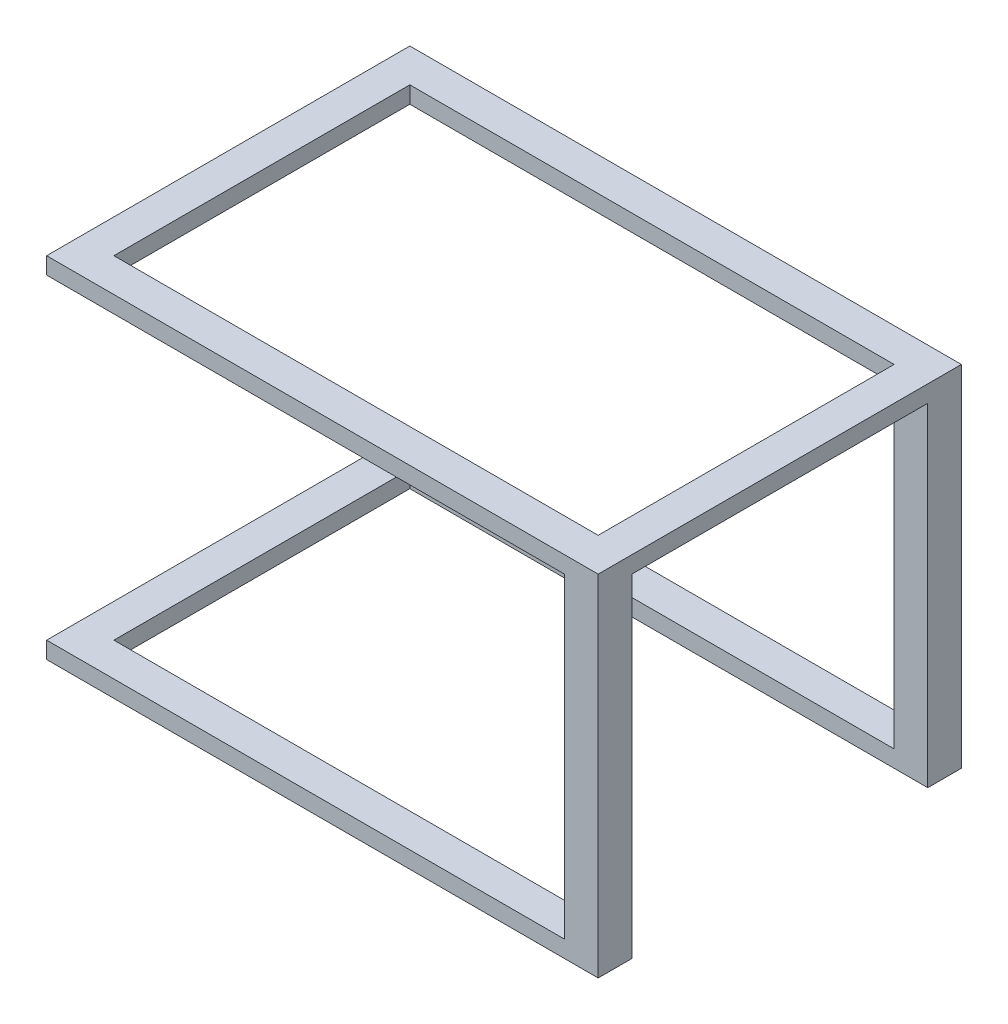
ISO-10303-21;
HEADER;
FILE_DESCRIPTION(('STEP AP214'),'2;1');
FILE_NAME('part.step','',(''),(''),'','','');
FILE_SCHEMA(('AUTOMOTIVE_DESIGN { 1 0 10303 214 1 1 1 1 }'));
ENDSEC;
DATA;
#1=APPLICATION_CONTEXT('core data for automotive mechanical design processes');
#2=APPLICATION_PROTOCOL_DEFINITION('international standard','automotive_design',2000,#1);
#3=PRODUCT_CONTEXT('',#1,'mechanical');
#4=PRODUCT('Part','Part','',(#3));
#5=PRODUCT_RELATED_PRODUCT_CATEGORY('part','',(#4));
#6=PRODUCT_DEFINITION_FORMATION('','',#4);
#7=PRODUCT_DEFINITION_CONTEXT('part definition',#1,'design');
#8=PRODUCT_DEFINITION('design','',#6,#7);
#9=PRODUCT_DEFINITION_SHAPE('','',#8);
#10=(LENGTH_UNIT() NAMED_UNIT(*) SI_UNIT(.MILLI.,.METRE.));
#11=(NAMED_UNIT(*) PLANE_ANGLE_UNIT() SI_UNIT($,.RADIAN.));
#12=(NAMED_UNIT(*) SI_UNIT($,.STERADIAN.) SOLID_ANGLE_UNIT());
#13=UNCERTAINTY_MEASURE_WITH_UNIT(LENGTH_MEASURE(1.E-05),#10,'distance_accuracy_value','');
#14=(GEOMETRIC_REPRESENTATION_CONTEXT(3) GLOBAL_UNCERTAINTY_ASSIGNED_CONTEXT((#13)) GLOBAL_UNIT_ASSIGNED_CONTEXT((#10,
#11,#12)) REPRESENTATION_CONTEXT('',''));
#15=CARTESIAN_POINT('',(0.,0.,0.));
#16=DIRECTION('',(0.,0.,1.));
#17=DIRECTION('',(1.,0.,0.));
#18=AXIS2_PLACEMENT_3D('',#15,#16,#17);
#19=CARTESIAN_POINT('',(587.28007311288,-49.5244188250893,415.065585719393));
#20=DIRECTION('',(1.,0.,0.));
#21=DIRECTION('',(0.,1.,0.));
#22=AXIS2_PLACEMENT_3D('',#19,#20,#21);
#23=PLANE('',#22);
#24=DIRECTION('',(0.,0.,-1.));
#25=VECTOR('',#24,1.);
#26=CARTESIAN_POINT('',(587.28007311288,-49.5244188250893,415.065585719393));
#27=LINE('',#26,#25);
#28=CARTESIAN_POINT('',(587.28007311288,-49.5244188250893,415.065585719393));
#29=VERTEX_POINT('',#28);
#30=CARTESIAN_POINT('',(587.28007311288,-49.5244188250893,365.065585719393));
#31=VERTEX_POINT('',#30);
#32=EDGE_CURVE('E47',#29,#31,#27,.T.);
#33=ORIENTED_EDGE('',*,*,#32,.T.);
#34=DIRECTION('',(0.,-1.,0.));
#35=VECTOR('',#34,1.);
#36=CARTESIAN_POINT('',(587.28007311288,-49.5244188250893,365.065585719393));
#37=LINE('',#36,#35);
#38=CARTESIAN_POINT('',(587.28007311288,-519.524418825089,365.065585719393));
#39=VERTEX_POINT('',#38);
#40=EDGE_CURVE('E202',#31,#39,#37,.T.);
#41=ORIENTED_EDGE('',*,*,#40,.T.);
#42=DIRECTION('',(0.,0.,-1.));
#43=VECTOR('',#42,1.);
#44=CARTESIAN_POINT('',(587.28007311288,-519.524418825089,415.065585719393));
#45=LINE('',#44,#43);
#46=CARTESIAN_POINT('',(587.28007311288,-519.524418825089,415.065585719393));
#47=VERTEX_POINT('',#46);
#48=EDGE_CURVE('E238',#47,#39,#45,.T.);
#49=ORIENTED_EDGE('',*,*,#48,.F.);
#50=DIRECTION('',(0.,-1.,0.));
#51=VECTOR('',#50,1.);
#52=CARTESIAN_POINT('',(587.28007311288,-49.5244188250893,415.065585719393));
#53=LINE('',#52,#51);
#54=EDGE_CURVE('E235',#29,#47,#53,.T.);
#55=ORIENTED_EDGE('',*,*,#54,.F.);
#56=EDGE_LOOP('',(#33,#41,#49,#55));
#57=FACE_BOUND('',#56,.T.);
#58=ADVANCED_FACE('F37',(#57),#23,.F.);
#59=DIRECTION('',(0.,1.,0.));
#60=VECTOR('',#59,1.);
#61=CARTESIAN_POINT('',(587.28007311288,-544.524418825089,-74.934414280607));
#62=LINE('',#61,#60);
#63=CARTESIAN_POINT('',(587.28007311288,-49.5244188250893,-74.934414280607));
#64=VERTEX_POINT('',#63);
#65=CARTESIAN_POINT('',(587.28007311288,-24.5244188250893,-74.934414280607));
#66=VERTEX_POINT('',#65);
#67=EDGE_CURVE('E226',#64,#66,#62,.T.);
#68=ORIENTED_EDGE('',*,*,#67,.F.);
#69=DIRECTION('',(0.,0.,1.));
#70=VECTOR('',#69,1.);
#71=CARTESIAN_POINT('',(587.28007311288,-49.5244188250893,415.065585719393));
#72=LINE('',#71,#70);
#73=EDGE_CURVE('E212',#64,#31,#72,.T.);
#74=ORIENTED_EDGE('',*,*,#73,.T.);
#75=DIRECTION('',(0.,1.,0.));
#76=VECTOR('',#75,1.);
#77=CARTESIAN_POINT('',(587.28007311288,-544.524418825089,365.065585719393));
#78=LINE('',#77,#76);
#79=CARTESIAN_POINT('',(587.28007311288,-24.5244188250893,365.065585719393));
#80=VERTEX_POINT('',#79);
#81=EDGE_CURVE('E223',#31,#80,#78,.T.);
#82=ORIENTED_EDGE('',*,*,#81,.T.);
#83=DIRECTION('',(0.,0.,-1.));
#84=VECTOR('',#83,1.);
#85=CARTESIAN_POINT('',(587.28007311288,-24.5244188250893,-74.934414280607));
#86=LINE('',#85,#84);
#87=EDGE_CURVE('E247',#80,#66,#86,.T.);
#88=ORIENTED_EDGE('',*,*,#87,.T.);
#89=EDGE_LOOP('',(#68,#74,#82,#88));
#90=FACE_BOUND('',#89,.T.);
#91=ADVANCED_FACE('F220',(#90),#23,.F.);
#92=CARTESIAN_POINT('',(-182.71992688712,-24.5244188250893,415.065585719393));
#93=DIRECTION('',(1.,0.,0.));
#94=DIRECTION('',(0.,0.,-1.));
#95=AXIS2_PLACEMENT_3D('',#92,#93,#94);
#96=PLANE('',#95);
#97=DIRECTION('',(0.,-1.,0.));
#98=VECTOR('',#97,1.);
#99=CARTESIAN_POINT('',(-182.71992688712,-24.5244188250893,-124.934414280607));
#100=LINE('',#99,#98);
#101=CARTESIAN_POINT('',(-182.71992688712,-24.5244188250893,-124.934414280607));
#102=VERTEX_POINT('',#101);
#103=CARTESIAN_POINT('',(-182.71992688712,-49.5244188250893,-124.934414280607));
#104=VERTEX_POINT('',#103);
#105=EDGE_CURVE('E252',#102,#104,#100,.T.);
#106=ORIENTED_EDGE('',*,*,#105,.T.);
#107=DIRECTION('',(0.,0.,-1.));
#108=VECTOR('',#107,1.);
#109=CARTESIAN_POINT('',(-182.71992688712,-49.5244188250893,415.065585719393));
#110=LINE('',#109,#108);
#111=CARTESIAN_POINT('',(-182.71992688712,-49.5244188250893,415.065585719393));
#112=VERTEX_POINT('',#111);
#113=EDGE_CURVE('E11',#112,#104,#110,.T.);
#114=ORIENTED_EDGE('',*,*,#113,.F.);
#115=DIRECTION('',(0.,-1.,0.));
#116=VECTOR('',#115,1.);
#117=CARTESIAN_POINT('',(-182.71992688712,-24.5244188250893,415.065585719393));
#118=LINE('',#117,#116);
#119=CARTESIAN_POINT('',(-182.71992688712,-24.5244188250893,415.065585719393));
#120=VERTEX_POINT('',#119);
#121=EDGE_CURVE('E254',#120,#112,#118,.T.);
#122=ORIENTED_EDGE('',*,*,#121,.F.);
#123=DIRECTION('',(0.,0.,-1.));
#124=VECTOR('',#123,1.);
#125=CARTESIAN_POINT('',(-182.71992688712,-24.5244188250893,415.065585719393));
#126=LINE('',#125,#124);
#127=EDGE_CURVE('E261',#120,#102,#126,.T.);
#128=ORIENTED_EDGE('',*,*,#127,.T.);
#129=EDGE_LOOP('',(#106,#114,#122,#128));
#130=FACE_BOUND('',#129,.T.);
#131=ADVANCED_FACE('F357',(#130),#96,.F.);
#132=CARTESIAN_POINT('',(-182.71992688712,-49.5244188250893,415.065585719393));
#133=DIRECTION('',(0.,1.,0.));
#134=DIRECTION('',(0.,0.,1.));
#135=AXIS2_PLACEMENT_3D('',#132,#133,#134);
#136=PLANE('',#135);
#137=DIRECTION('',(0.,0.,-1.));
#138=VECTOR('',#137,1.);
#139=CARTESIAN_POINT('',(587.28007311288,-49.5244188250893,415.065585719393));
#140=LINE('',#139,#138);
#141=CARTESIAN_POINT('',(587.28007311288,-49.5244188250893,-124.934414280607));
#142=VERTEX_POINT('',#141);
#143=EDGE_CURVE('E236',#64,#142,#140,.T.);
#144=ORIENTED_EDGE('',*,*,#143,.F.);
#145=DIRECTION('',(-1.,0.,0.));
#146=VECTOR('',#145,1.);
#147=CARTESIAN_POINT('',(-182.71992688712,-49.5244188250893,-74.9344142806071));
#148=LINE('',#147,#146);
#149=CARTESIAN_POINT('',(-132.71992688712,-49.5244188250893,-74.934414280607));
#150=VERTEX_POINT('',#149);
#151=EDGE_CURVE('E183',#64,#150,#148,.T.);
#152=ORIENTED_EDGE('',*,*,#151,.T.);
#153=DIRECTION('',(0.,0.,1.));
#154=VECTOR('',#153,1.);
#155=CARTESIAN_POINT('',(-132.71992688712,-49.5244188250893,415.065585719393));
#156=LINE('',#155,#154);
#157=CARTESIAN_POINT('',(-132.71992688712,-49.5244188250893,365.065585719393));
#158=VERTEX_POINT('',#157);
#159=EDGE_CURVE('E192',#150,#158,#156,.T.);
#160=ORIENTED_EDGE('',*,*,#159,.T.);
#161=DIRECTION('',(1.,0.,0.));
#162=VECTOR('',#161,1.);
#163=CARTESIAN_POINT('',(-182.71992688712,-49.5244188250893,365.065585719393));
#164=LINE('',#163,#162);
#165=EDGE_CURVE('E188',#158,#31,#164,.T.);
#166=ORIENTED_EDGE('',*,*,#165,.T.);
#167=ORIENTED_EDGE('',*,*,#32,.F.);
#168=DIRECTION('',(1.,0.,0.));
#169=VECTOR('',#168,1.);
#170=CARTESIAN_POINT('',(-182.71992688712,-49.5244188250893,415.065585719393));
#171=LINE('',#170,#169);
#172=EDGE_CURVE('E164',#112,#29,#171,.T.);
#173=ORIENTED_EDGE('',*,*,#172,.F.);
#174=ORIENTED_EDGE('',*,*,#113,.T.);
#175=DIRECTION('',(1.,0.,0.));
#176=VECTOR('',#175,1.);
#177=CARTESIAN_POINT('',(-182.71992688712,-49.5244188250893,-124.934414280607));
#178=LINE('',#177,#176);
#179=EDGE_CURVE('E175',#104,#142,#178,.T.);
#180=ORIENTED_EDGE('',*,*,#179,.T.);
#181=EDGE_LOOP('',(#144,#152,#160,#166,#167,#173,#174,#180));
#182=FACE_BOUND('',#181,.T.);
#183=ADVANCED_FACE('F189',(#182),#136,.F.);
#184=DIRECTION('',(0.,0.,-1.));
#185=VECTOR('',#184,1.);
#186=CARTESIAN_POINT('',(587.28007311288,-519.524418825089,415.065585719393));
#187=LINE('',#186,#185);
#188=CARTESIAN_POINT('',(587.28007311288,-519.524418825089,-74.9344142806071));
#189=VERTEX_POINT('',#188);
#190=CARTESIAN_POINT('',(587.28007311288,-519.524418825089,-124.934414280607));
#191=VERTEX_POINT('',#190);
#192=EDGE_CURVE('E242',#189,#191,#187,.T.);
#193=ORIENTED_EDGE('',*,*,#192,.F.);
#194=DIRECTION('',(0.,1.,0.));
#195=VECTOR('',#194,1.);
#196=CARTESIAN_POINT('',(587.28007311288,-49.5244188250892,-74.934414280607));
#197=LINE('',#196,#195);
#198=EDGE_CURVE('E209',#189,#64,#197,.T.);
#199=ORIENTED_EDGE('',*,*,#198,.T.);
#200=ORIENTED_EDGE('',*,*,#143,.T.);
#201=DIRECTION('',(0.,-1.,0.));
#202=VECTOR('',#201,1.);
#203=CARTESIAN_POINT('',(587.28007311288,-49.5244188250893,-124.934414280607));
#204=LINE('',#203,#202);
#205=EDGE_CURVE('E257',#142,#191,#204,.T.);
#206=ORIENTED_EDGE('',*,*,#205,.T.);
#207=EDGE_LOOP('',(#193,#199,#200,#206));
#208=FACE_BOUND('',#207,.T.);
#209=ADVANCED_FACE('F333',(#208),#23,.F.);
#210=CARTESIAN_POINT('',(587.28007311288,-519.524418825089,415.065585719393));
#211=DIRECTION('',(0.,-1.,0.));
#212=DIRECTION('',(1.,0.,0.));
#213=AXIS2_PLACEMENT_3D('',#210,#211,#212);
#214=PLANE('',#213);
#215=DIRECTION('',(0.,0.,-1.));
#216=VECTOR('',#215,1.);
#217=CARTESIAN_POINT('',(-132.71992688712,-519.524418825089,415.065585719393));
#218=LINE('',#217,#216);
#219=CARTESIAN_POINT('',(-132.71992688712,-519.524418825089,365.065585719393));
#220=VERTEX_POINT('',#219);
#221=CARTESIAN_POINT('',(-132.71992688712,-519.524418825089,-74.934414280607));
#222=VERTEX_POINT('',#221);
#223=EDGE_CURVE('E251',#220,#222,#218,.T.);
#224=ORIENTED_EDGE('',*,*,#223,.T.);
#225=DIRECTION('',(1.,0.,0.));
#226=VECTOR('',#225,1.);
#227=CARTESIAN_POINT('',(587.28007311288,-519.524418825089,-74.9344142806071));
#228=LINE('',#227,#226);
#229=EDGE_CURVE('E197',#222,#189,#228,.T.);
#230=ORIENTED_EDGE('',*,*,#229,.T.);
#231=ORIENTED_EDGE('',*,*,#192,.T.);
#232=DIRECTION('',(-1.,0.,0.));
#233=VECTOR('',#232,1.);
#234=CARTESIAN_POINT('',(587.28007311288,-519.524418825089,-124.934414280607));
#235=LINE('',#234,#233);
#236=CARTESIAN_POINT('',(-182.71992688712,-519.524418825089,-124.934414280607));
#237=VERTEX_POINT('',#236);
#238=EDGE_CURVE('E299',#191,#237,#235,.T.);
#239=ORIENTED_EDGE('',*,*,#238,.T.);
#240=DIRECTION('',(0.,0.,-1.));
#241=VECTOR('',#240,1.);
#242=CARTESIAN_POINT('',(-182.71992688712,-519.524418825089,415.065585719393));
#243=LINE('',#242,#241);
#244=CARTESIAN_POINT('',(-182.71992688712,-519.524418825089,415.065585719393));
#245=VERTEX_POINT('',#244);
#246=EDGE_CURVE('E291',#245,#237,#243,.T.);
#247=ORIENTED_EDGE('',*,*,#246,.F.);
#248=DIRECTION('',(-1.,0.,0.));
#249=VECTOR('',#248,1.);
#250=CARTESIAN_POINT('',(587.28007311288,-519.524418825089,415.065585719393));
#251=LINE('',#250,#249);
#252=EDGE_CURVE('E244',#47,#245,#251,.T.);
#253=ORIENTED_EDGE('',*,*,#252,.F.);
#254=ORIENTED_EDGE('',*,*,#48,.T.);
#255=DIRECTION('',(-1.,0.,0.));
#256=VECTOR('',#255,1.);
#257=CARTESIAN_POINT('',(587.28007311288,-519.524418825089,365.065585719393));
#258=LINE('',#257,#256);
#259=EDGE_CURVE('E198',#39,#220,#258,.T.);
#260=ORIENTED_EDGE('',*,*,#259,.T.);
#261=EDGE_LOOP('',(#224,#230,#231,#239,#247,#253,#254,#260));
#262=FACE_BOUND('',#261,.T.);
#263=ADVANCED_FACE('F323',(#262),#214,.F.);
#264=CARTESIAN_POINT('',(-182.71992688712,-519.524418825089,415.065585719393));
#265=DIRECTION('',(1.,0.,0.));
#266=DIRECTION('',(0.,0.,-1.));
#267=AXIS2_PLACEMENT_3D('',#264,#265,#266);
#268=PLANE('',#267);
#269=DIRECTION('',(0.,-1.,0.));
#270=VECTOR('',#269,1.);
#271=CARTESIAN_POINT('',(-182.71992688712,-519.524418825089,-124.934414280607));
#272=LINE('',#271,#270);
#273=CARTESIAN_POINT('',(-182.71992688712,-544.524418825089,-124.934414280607));
#274=VERTEX_POINT('',#273);
#275=EDGE_CURVE('E294',#237,#274,#272,.T.);
#276=ORIENTED_EDGE('',*,*,#275,.T.);
#277=DIRECTION('',(0.,0.,-1.));
#278=VECTOR('',#277,1.);
#279=CARTESIAN_POINT('',(-182.71992688712,-544.524418825089,415.065585719393));
#280=LINE('',#279,#278);
#281=CARTESIAN_POINT('',(-182.71992688712,-544.524418825089,415.065585719393));
#282=VERTEX_POINT('',#281);
#283=EDGE_CURVE('E276',#282,#274,#280,.T.);
#284=ORIENTED_EDGE('',*,*,#283,.F.);
#285=DIRECTION('',(0.,-1.,0.));
#286=VECTOR('',#285,1.);
#287=CARTESIAN_POINT('',(-182.71992688712,-519.524418825089,415.065585719393));
#288=LINE('',#287,#286);
#289=EDGE_CURVE('E288',#245,#282,#288,.T.);
#290=ORIENTED_EDGE('',*,*,#289,.F.);
#291=ORIENTED_EDGE('',*,*,#246,.T.);
#292=EDGE_LOOP('',(#276,#284,#290,#291));
#293=FACE_BOUND('',#292,.T.);
#294=ADVANCED_FACE('F353',(#293),#268,.F.);
#295=CARTESIAN_POINT('',(637.28007311288,-544.524418825089,415.065585719393));
#296=DIRECTION('',(0.,1.,0.));
#297=DIRECTION('',(0.,0.,1.));
#298=AXIS2_PLACEMENT_3D('',#295,#296,#297);
#299=PLANE('',#298);
#300=DIRECTION('',(1.,0.,0.));
#301=VECTOR('',#300,1.);
#302=CARTESIAN_POINT('',(-132.71992688712,-544.524418825089,365.065585719393));
#303=LINE('',#302,#301);
#304=CARTESIAN_POINT('',(-132.71992688712,-544.524418825089,365.065585719393));
#305=VERTEX_POINT('',#304);
#306=CARTESIAN_POINT('',(637.28007311288,-544.524418825089,365.065585719393));
#307=VERTEX_POINT('',#306);
#308=EDGE_CURVE('E121',#305,#307,#303,.T.);
#309=ORIENTED_EDGE('',*,*,#308,.T.);
#310=DIRECTION('',(0.,0.,-1.));
#311=VECTOR('',#310,1.);
#312=CARTESIAN_POINT('',(637.28007311288,-544.524418825089,415.065585719393));
#313=LINE('',#312,#311);
#314=CARTESIAN_POINT('',(637.28007311288,-544.524418825089,415.065585719393));
#315=VERTEX_POINT('',#314);
#316=EDGE_CURVE('E273',#315,#307,#313,.T.);
#317=ORIENTED_EDGE('',*,*,#316,.F.);
#318=DIRECTION('',(1.,0.,0.));
#319=VECTOR('',#318,1.);
#320=CARTESIAN_POINT('',(637.28007311288,-544.524418825089,415.065585719393));
#321=LINE('',#320,#319);
#322=EDGE_CURVE('E129',#282,#315,#321,.T.);
#323=ORIENTED_EDGE('',*,*,#322,.F.);
#324=ORIENTED_EDGE('',*,*,#283,.T.);
#325=DIRECTION('',(1.,0.,0.));
#326=VECTOR('',#325,1.);
#327=CARTESIAN_POINT('',(637.28007311288,-544.524418825089,-124.934414280607));
#328=LINE('',#327,#326);
#329=CARTESIAN_POINT('',(637.28007311288,-544.524418825089,-124.934414280607));
#330=VERTEX_POINT('',#329);
#331=EDGE_CURVE('E284',#274,#330,#328,.T.);
#332=ORIENTED_EDGE('',*,*,#331,.T.);
#333=DIRECTION('',(0.,0.,-1.));
#334=VECTOR('',#333,1.);
#335=CARTESIAN_POINT('',(637.28007311288,-544.524418825089,415.065585719393));
#336=LINE('',#335,#334);
#337=CARTESIAN_POINT('',(637.28007311288,-544.524418825089,-74.9344142806071));
#338=VERTEX_POINT('',#337);
#339=EDGE_CURVE('E272',#338,#330,#336,.T.);
#340=ORIENTED_EDGE('',*,*,#339,.F.);
#341=DIRECTION('',(-1.,0.,0.));
#342=VECTOR('',#341,1.);
#343=CARTESIAN_POINT('',(-132.71992688712,-544.524418825089,-74.934414280607));
#344=LINE('',#343,#342);
#345=CARTESIAN_POINT('',(-132.71992688712,-544.524418825089,-74.934414280607));
#346=VERTEX_POINT('',#345);
#347=EDGE_CURVE('E56',#338,#346,#344,.T.);
#348=ORIENTED_EDGE('',*,*,#347,.T.);
#349=DIRECTION('',(0.,0.,1.));
#350=VECTOR('',#349,1.);
#351=CARTESIAN_POINT('',(-132.71992688712,-544.524418825089,-74.934414280607));
#352=LINE('',#351,#350);
#353=EDGE_CURVE('E268',#346,#305,#352,.T.);
#354=ORIENTED_EDGE('',*,*,#353,.T.);
#355=EDGE_LOOP('',(#309,#317,#323,#324,#332,#340,#348,#354));
#356=FACE_BOUND('',#355,.T.);
#357=ADVANCED_FACE('F326',(#356),#299,.F.);
#358=CARTESIAN_POINT('',(637.28007311288,-24.5244188250893,415.065585719393));
#359=DIRECTION('',(-1.,0.,0.));
#360=DIRECTION('',(0.,-1.,0.));
#361=AXIS2_PLACEMENT_3D('',#358,#359,#360);
#362=PLANE('',#361);
#363=ORIENTED_EDGE('',*,*,#316,.T.);
#364=DIRECTION('',(0.,-1.,0.));
#365=VECTOR('',#364,1.);
#366=CARTESIAN_POINT('',(637.28007311288,-49.5244188250893,365.065585719393));
#367=LINE('',#366,#365);
#368=CARTESIAN_POINT('',(637.28007311288,-49.5244188250893,365.065585719393));
#369=VERTEX_POINT('',#368);
#370=EDGE_CURVE('E277',#369,#307,#367,.T.);
#371=ORIENTED_EDGE('',*,*,#370,.F.);
#372=DIRECTION('',(0.,0.,1.));
#373=VECTOR('',#372,1.);
#374=CARTESIAN_POINT('',(637.28007311288,-49.5244188250893,365.065585719393));
#375=LINE('',#374,#373);
#376=CARTESIAN_POINT('',(637.28007311288,-49.5244188250893,-74.934414280607));
#377=VERTEX_POINT('',#376);
#378=EDGE_CURVE('E214',#377,#369,#375,.T.);
#379=ORIENTED_EDGE('',*,*,#378,.F.);
#380=DIRECTION('',(0.,1.,0.));
#381=VECTOR('',#380,1.);
#382=CARTESIAN_POINT('',(637.28007311288,-49.5244188250893,-74.934414280607));
#383=LINE('',#382,#381);
#384=EDGE_CURVE('E279',#338,#377,#383,.T.);
#385=ORIENTED_EDGE('',*,*,#384,.F.);
#386=ORIENTED_EDGE('',*,*,#339,.T.);
#387=DIRECTION('',(0.,1.,0.));
#388=VECTOR('',#387,1.);
#389=CARTESIAN_POINT('',(637.28007311288,-24.5244188250893,-124.934414280607));
#390=LINE('',#389,#388);
#391=CARTESIAN_POINT('',(637.28007311288,-24.5244188250893,-124.934414280607));
#392=VERTEX_POINT('',#391);
#393=EDGE_CURVE('E150',#330,#392,#390,.T.);
#394=ORIENTED_EDGE('',*,*,#393,.T.);
#395=DIRECTION('',(0.,0.,-1.));
#396=VECTOR('',#395,1.);
#397=CARTESIAN_POINT('',(637.28007311288,-24.5244188250893,415.065585719393));
#398=LINE('',#397,#396);
#399=CARTESIAN_POINT('',(637.28007311288,-24.5244188250893,415.065585719393));
#400=VERTEX_POINT('',#399);
#401=EDGE_CURVE('E263',#400,#392,#398,.T.);
#402=ORIENTED_EDGE('',*,*,#401,.F.);
#403=DIRECTION('',(0.,1.,0.));
#404=VECTOR('',#403,1.);
#405=CARTESIAN_POINT('',(637.28007311288,-24.5244188250893,415.065585719393));
#406=LINE('',#405,#404);
#407=EDGE_CURVE('E133',#315,#400,#406,.T.);
#408=ORIENTED_EDGE('',*,*,#407,.F.);
#409=EDGE_LOOP('',(#363,#371,#379,#385,#386,#394,#402,#408));
#410=FACE_BOUND('',#409,.T.);
#411=ADVANCED_FACE('F329',(#410),#362,.F.);
#412=CARTESIAN_POINT('',(-182.71992688712,-24.5244188250893,415.065585719393));
#413=DIRECTION('',(0.,-1.,0.));
#414=DIRECTION('',(1.,0.,0.));
#415=AXIS2_PLACEMENT_3D('',#412,#413,#414);
#416=PLANE('',#415);
#417=DIRECTION('',(1.,0.,0.));
#418=VECTOR('',#417,1.);
#419=CARTESIAN_POINT('',(-132.71992688712,-24.5244188250893,365.065585719393));
#420=LINE('',#419,#418);
#421=CARTESIAN_POINT('',(-132.71992688712,-24.5244188250893,365.065585719393));
#422=VERTEX_POINT('',#421);
#423=EDGE_CURVE('E230',#422,#80,#420,.T.);
#424=ORIENTED_EDGE('',*,*,#423,.F.);
#425=DIRECTION('',(0.,0.,1.));
#426=VECTOR('',#425,1.);
#427=CARTESIAN_POINT('',(-132.71992688712,-24.5244188250893,-74.934414280607));
#428=LINE('',#427,#426);
#429=CARTESIAN_POINT('',(-132.71992688712,-24.5244188250893,-74.934414280607));
#430=VERTEX_POINT('',#429);
#431=EDGE_CURVE('E208',#430,#422,#428,.T.);
#432=ORIENTED_EDGE('',*,*,#431,.F.);
#433=DIRECTION('',(-1.,0.,0.));
#434=VECTOR('',#433,1.);
#435=CARTESIAN_POINT('',(-132.71992688712,-24.5244188250893,-74.934414280607));
#436=LINE('',#435,#434);
#437=EDGE_CURVE('E248',#66,#430,#436,.T.);
#438=ORIENTED_EDGE('',*,*,#437,.F.);
#439=ORIENTED_EDGE('',*,*,#87,.F.);
#440=EDGE_LOOP('',(#424,#432,#438,#439));
#441=FACE_BOUND('',#440,.T.);
#442=DIRECTION('',(-1.,0.,0.));
#443=VECTOR('',#442,1.);
#444=CARTESIAN_POINT('',(-182.71992688712,-24.5244188250893,-124.934414280607));
#445=LINE('',#444,#443);
#446=EDGE_CURVE('E156',#392,#102,#445,.T.);
#447=ORIENTED_EDGE('',*,*,#446,.T.);
#448=ORIENTED_EDGE('',*,*,#127,.F.);
#449=DIRECTION('',(-1.,0.,0.));
#450=VECTOR('',#449,1.);
#451=CARTESIAN_POINT('',(-182.71992688712,-24.5244188250893,415.065585719393));
#452=LINE('',#451,#450);
#453=EDGE_CURVE('E138',#400,#120,#452,.T.);
#454=ORIENTED_EDGE('',*,*,#453,.F.);
#455=ORIENTED_EDGE('',*,*,#401,.T.);
#456=EDGE_LOOP('',(#447,#448,#454,#455));
#457=FACE_BOUND('',#456,.T.);
#458=ADVANCED_FACE('F342',(#441,#457),#416,.F.);
#459=CARTESIAN_POINT('',(747.423958004966,-233.373339688399,415.065585719393));
#460=DIRECTION('',(0.,0.,1.));
#461=DIRECTION('',(1.,0.,0.));
#462=AXIS2_PLACEMENT_3D('',#459,#460,#461);
#463=PLANE('',#462);
#464=ORIENTED_EDGE('',*,*,#121,.T.);
#465=ORIENTED_EDGE('',*,*,#172,.T.);
#466=ORIENTED_EDGE('',*,*,#54,.T.);
#467=ORIENTED_EDGE('',*,*,#252,.T.);
#468=ORIENTED_EDGE('',*,*,#289,.T.);
#469=ORIENTED_EDGE('',*,*,#322,.T.);
#470=ORIENTED_EDGE('',*,*,#407,.T.);
#471=ORIENTED_EDGE('',*,*,#453,.T.);
#472=EDGE_LOOP('',(#464,#465,#466,#467,#468,#469,#470,#471));
#473=FACE_BOUND('',#472,.T.);
#474=ADVANCED_FACE('F346',(#473),#463,.T.);
#475=CARTESIAN_POINT('',(747.423958004966,-233.373339688399,-124.934414280607));
#476=DIRECTION('',(0.,0.,1.));
#477=DIRECTION('',(1.,0.,0.));
#478=AXIS2_PLACEMENT_3D('',#475,#476,#477);
#479=PLANE('',#478);
#480=ORIENTED_EDGE('',*,*,#105,.F.);
#481=ORIENTED_EDGE('',*,*,#446,.F.);
#482=ORIENTED_EDGE('',*,*,#393,.F.);
#483=ORIENTED_EDGE('',*,*,#331,.F.);
#484=ORIENTED_EDGE('',*,*,#275,.F.);
#485=ORIENTED_EDGE('',*,*,#238,.F.);
#486=ORIENTED_EDGE('',*,*,#205,.F.);
#487=ORIENTED_EDGE('',*,*,#179,.F.);
#488=EDGE_LOOP('',(#480,#481,#482,#483,#484,#485,#486,#487));
#489=FACE_BOUND('',#488,.T.);
#490=ADVANCED_FACE('F358',(#489),#479,.F.);
#491=CARTESIAN_POINT('',(-132.71992688712,-544.524418825089,365.065585719393));
#492=DIRECTION('',(0.,0.,1.));
#493=DIRECTION('',(1.,0.,0.));
#494=AXIS2_PLACEMENT_3D('',#491,#492,#493);
#495=PLANE('',#494);
#496=DIRECTION('',(0.,1.,0.));
#497=VECTOR('',#496,1.);
#498=CARTESIAN_POINT('',(-132.71992688712,-544.524418825089,365.065585719393));
#499=LINE('',#498,#497);
#500=EDGE_CURVE('E296',#158,#422,#499,.T.);
#501=ORIENTED_EDGE('',*,*,#500,.T.);
#502=ORIENTED_EDGE('',*,*,#423,.T.);
#503=ORIENTED_EDGE('',*,*,#81,.F.);
#504=ORIENTED_EDGE('',*,*,#165,.F.);
#505=EDGE_LOOP('',(#501,#502,#503,#504));
#506=FACE_BOUND('',#505,.T.);
#507=ADVANCED_FACE('F228',(#506),#495,.F.);
#508=CARTESIAN_POINT('',(-132.71992688712,-544.524418825089,-74.934414280607));
#509=DIRECTION('',(0.,0.,-1.));
#510=DIRECTION('',(-1.,0.,0.));
#511=AXIS2_PLACEMENT_3D('',#508,#509,#510);
#512=PLANE('',#511);
#513=ORIENTED_EDGE('',*,*,#67,.T.);
#514=ORIENTED_EDGE('',*,*,#437,.T.);
#515=DIRECTION('',(0.,1.,0.));
#516=VECTOR('',#515,1.);
#517=CARTESIAN_POINT('',(-132.71992688712,-544.524418825089,-74.934414280607));
#518=LINE('',#517,#516);
#519=EDGE_CURVE('E245',#150,#430,#518,.T.);
#520=ORIENTED_EDGE('',*,*,#519,.F.);
#521=ORIENTED_EDGE('',*,*,#151,.F.);
#522=EDGE_LOOP('',(#513,#514,#520,#521));
#523=FACE_BOUND('',#522,.T.);
#524=ADVANCED_FACE('F336',(#523),#512,.F.);
#525=CARTESIAN_POINT('',(-132.71992688712,-544.524418825089,-74.934414280607));
#526=DIRECTION('',(-1.,0.,0.));
#527=DIRECTION('',(0.,0.,1.));
#528=AXIS2_PLACEMENT_3D('',#525,#526,#527);
#529=PLANE('',#528);
#530=ORIENTED_EDGE('',*,*,#519,.T.);
#531=ORIENTED_EDGE('',*,*,#431,.T.);
#532=ORIENTED_EDGE('',*,*,#500,.F.);
#533=ORIENTED_EDGE('',*,*,#159,.F.);
#534=EDGE_LOOP('',(#530,#531,#532,#533));
#535=FACE_BOUND('',#534,.T.);
#536=ADVANCED_FACE('F340',(#535),#529,.F.);
#537=DIRECTION('',(0.,1.,0.));
#538=VECTOR('',#537,1.);
#539=CARTESIAN_POINT('',(-132.71992688712,-544.524418825089,365.065585719393));
#540=LINE('',#539,#538);
#541=EDGE_CURVE('E232',#305,#220,#540,.T.);
#542=ORIENTED_EDGE('',*,*,#541,.F.);
#543=ORIENTED_EDGE('',*,*,#353,.F.);
#544=DIRECTION('',(0.,1.,0.));
#545=VECTOR('',#544,1.);
#546=CARTESIAN_POINT('',(-132.71992688712,-544.524418825089,-74.934414280607));
#547=LINE('',#546,#545);
#548=EDGE_CURVE('E310',#346,#222,#547,.T.);
#549=ORIENTED_EDGE('',*,*,#548,.T.);
#550=ORIENTED_EDGE('',*,*,#223,.F.);
#551=EDGE_LOOP('',(#542,#543,#549,#550));
#552=FACE_BOUND('',#551,.T.);
#553=ADVANCED_FACE('F321',(#552),#529,.F.);
#554=ORIENTED_EDGE('',*,*,#198,.F.);
#555=ORIENTED_EDGE('',*,*,#229,.F.);
#556=ORIENTED_EDGE('',*,*,#548,.F.);
#557=ORIENTED_EDGE('',*,*,#347,.F.);
#558=ORIENTED_EDGE('',*,*,#384,.T.);
#559=DIRECTION('',(1.,0.,0.));
#560=VECTOR('',#559,1.);
#561=CARTESIAN_POINT('',(-22.7199268871196,-49.5244188250893,-74.934414280607));
#562=LINE('',#561,#560);
#563=EDGE_CURVE('E41',#64,#377,#562,.T.);
#564=ORIENTED_EDGE('',*,*,#563,.F.);
#565=EDGE_LOOP('',(#554,#555,#556,#557,#558,#564));
#566=FACE_BOUND('',#565,.T.);
#567=ADVANCED_FACE('F330',(#566),#512,.F.);
#568=ORIENTED_EDGE('',*,*,#370,.T.);
#569=ORIENTED_EDGE('',*,*,#308,.F.);
#570=ORIENTED_EDGE('',*,*,#541,.T.);
#571=ORIENTED_EDGE('',*,*,#259,.F.);
#572=ORIENTED_EDGE('',*,*,#40,.F.);
#573=DIRECTION('',(1.,0.,0.));
#574=VECTOR('',#573,1.);
#575=CARTESIAN_POINT('',(-22.7199268871196,-49.5244188250893,365.065585719393));
#576=LINE('',#575,#574);
#577=EDGE_CURVE('E107',#31,#369,#576,.T.);
#578=ORIENTED_EDGE('',*,*,#577,.T.);
#579=EDGE_LOOP('',(#568,#569,#570,#571,#572,#578));
#580=FACE_BOUND('',#579,.T.);
#581=ADVANCED_FACE('F203',(#580),#495,.F.);
#582=CARTESIAN_POINT('',(-22.7199268871196,-49.5244188250893,365.065585719393));
#583=DIRECTION('',(0.,1.,0.));
#584=DIRECTION('',(-1.,0.,0.));
#585=AXIS2_PLACEMENT_3D('',#582,#583,#584);
#586=PLANE('',#585);
#587=ORIENTED_EDGE('',*,*,#563,.T.);
#588=ORIENTED_EDGE('',*,*,#378,.T.);
#589=ORIENTED_EDGE('',*,*,#577,.F.);
#590=ORIENTED_EDGE('',*,*,#73,.F.);
#591=EDGE_LOOP('',(#587,#588,#589,#590));
#592=FACE_BOUND('',#591,.T.);
#593=ADVANCED_FACE('F39',(#592),#586,.F.);
#594=CLOSED_SHELL('',(#58,#91,#131,#183,#209,#263,#294,#357,#411,#458,#474,#490,#507,#524,#536,
#553,#567,#581,#593));
#595=MANIFOLD_SOLID_BREP('B2',#594);
#596=ADVANCED_BREP_SHAPE_REPRESENTATION('',(#18,#595),#14);
#597=SHAPE_DEFINITION_REPRESENTATION(#9,#596);
ENDSEC;
END-ISO-10303-21;
